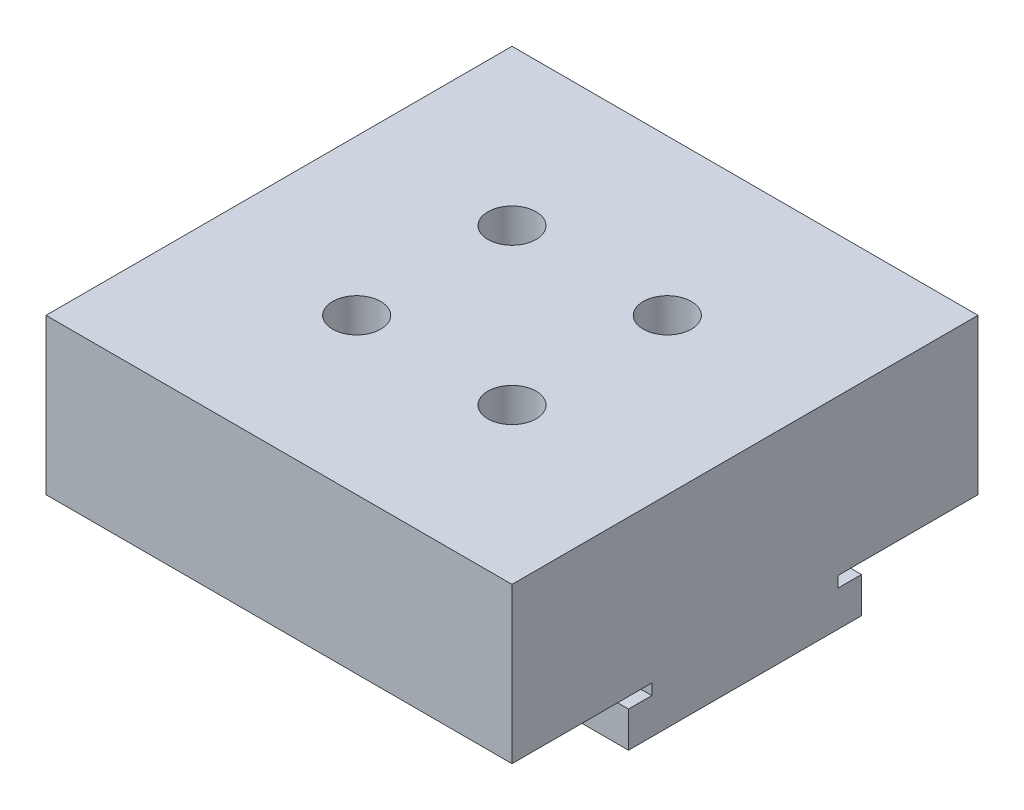
ISO-10303-21;
HEADER;
FILE_DESCRIPTION(('STEP AP214'),'2;1');
FILE_NAME('part.step','',(''),(''),'','','');
FILE_SCHEMA(('AUTOMOTIVE_DESIGN { 1 0 10303 214 1 1 1 1 }'));
ENDSEC;
DATA;
#1=APPLICATION_CONTEXT('core data for automotive mechanical design processes');
#2=APPLICATION_PROTOCOL_DEFINITION('international standard','automotive_design',2000,#1);
#3=PRODUCT_CONTEXT('',#1,'mechanical');
#4=PRODUCT('Part','Part','',(#3));
#5=PRODUCT_RELATED_PRODUCT_CATEGORY('part','',(#4));
#6=PRODUCT_DEFINITION_FORMATION('','',#4);
#7=PRODUCT_DEFINITION_CONTEXT('part definition',#1,'design');
#8=PRODUCT_DEFINITION('design','',#6,#7);
#9=PRODUCT_DEFINITION_SHAPE('','',#8);
#10=(LENGTH_UNIT() NAMED_UNIT(*) SI_UNIT(.MILLI.,.METRE.));
#11=(NAMED_UNIT(*) PLANE_ANGLE_UNIT() SI_UNIT($,.RADIAN.));
#12=(NAMED_UNIT(*) SI_UNIT($,.STERADIAN.) SOLID_ANGLE_UNIT());
#13=UNCERTAINTY_MEASURE_WITH_UNIT(LENGTH_MEASURE(1.E-05),#10,'distance_accuracy_value','');
#14=(GEOMETRIC_REPRESENTATION_CONTEXT(3) GLOBAL_UNCERTAINTY_ASSIGNED_CONTEXT((#13)) GLOBAL_UNIT_ASSIGNED_CONTEXT((#10,
#11,#12)) REPRESENTATION_CONTEXT('',''));
#15=CARTESIAN_POINT('',(0.,0.,0.));
#16=DIRECTION('',(0.,0.,1.));
#17=DIRECTION('',(1.,0.,0.));
#18=AXIS2_PLACEMENT_3D('',#15,#16,#17);
#19=CARTESIAN_POINT('',(0.,0.,0.));
#20=DIRECTION('',(0.,-1.,0.));
#21=DIRECTION('',(0.,0.,-1.));
#22=AXIS2_PLACEMENT_3D('',#19,#20,#21);
#23=PLANE('',#22);
#24=CARTESIAN_POINT('',(-5.,0.,-5.));
#25=DIRECTION('',(0.,-1.,0.));
#26=DIRECTION('',(0.,0.,-1.));
#27=AXIS2_PLACEMENT_3D('',#24,#25,#26);
#28=CIRCLE('',#27,3.5);
#29=CARTESIAN_POINT('',(-5.,0.,-8.5));
#30=VERTEX_POINT('',#29);
#31=EDGE_CURVE('E324',#30,#30,#28,.T.);
#32=ORIENTED_EDGE('',*,*,#31,.F.);
#33=EDGE_LOOP('',(#32));
#34=FACE_BOUND('',#33,.T.);
#35=CARTESIAN_POINT('',(5.,0.,-5.));
#36=DIRECTION('',(0.,-1.,0.));
#37=DIRECTION('',(0.,0.,-1.));
#38=AXIS2_PLACEMENT_3D('',#35,#36,#37);
#39=CIRCLE('',#38,3.5);
#40=CARTESIAN_POINT('',(5.,0.,-8.5));
#41=VERTEX_POINT('',#40);
#42=EDGE_CURVE('E338',#41,#41,#39,.T.);
#43=ORIENTED_EDGE('',*,*,#42,.F.);
#44=EDGE_LOOP('',(#43));
#45=FACE_BOUND('',#44,.T.);
#46=CARTESIAN_POINT('',(5.,0.,5.));
#47=DIRECTION('',(0.,-1.,0.));
#48=DIRECTION('',(0.,0.,-1.));
#49=AXIS2_PLACEMENT_3D('',#46,#47,#48);
#50=CIRCLE('',#49,3.5);
#51=CARTESIAN_POINT('',(5.,0.,1.5));
#52=VERTEX_POINT('',#51);
#53=EDGE_CURVE('E330',#52,#52,#50,.T.);
#54=ORIENTED_EDGE('',*,*,#53,.F.);
#55=EDGE_LOOP('',(#54));
#56=FACE_BOUND('',#55,.T.);
#57=CARTESIAN_POINT('',(-5.,0.,5.));
#58=DIRECTION('',(0.,-1.,0.));
#59=DIRECTION('',(0.,0.,-1.));
#60=AXIS2_PLACEMENT_3D('',#57,#58,#59);
#61=CIRCLE('',#60,3.5);
#62=CARTESIAN_POINT('',(-5.,0.,1.5));
#63=VERTEX_POINT('',#62);
#64=EDGE_CURVE('E329',#63,#63,#61,.T.);
#65=ORIENTED_EDGE('',*,*,#64,.F.);
#66=EDGE_LOOP('',(#65));
#67=FACE_BOUND('',#66,.T.);
#68=DIRECTION('',(-1.,0.,0.));
#69=VECTOR('',#68,1.);
#70=CARTESIAN_POINT('',(15.,0.,-6.));
#71=LINE('',#70,#69);
#72=CARTESIAN_POINT('',(15.,0.,-6.));
#73=VERTEX_POINT('',#72);
#74=CARTESIAN_POINT('',(9.00000000000001,0.,-6.));
#75=VERTEX_POINT('',#74);
#76=EDGE_CURVE('E189',#73,#75,#71,.T.);
#77=ORIENTED_EDGE('',*,*,#76,.T.);
#78=DIRECTION('',(0.,0.,-1.));
#79=VECTOR('',#78,1.);
#80=CARTESIAN_POINT('',(9.,0.,7.5));
#81=LINE('',#80,#79);
#82=CARTESIAN_POINT('',(9.,0.,6.));
#83=VERTEX_POINT('',#82);
#84=EDGE_CURVE('E260',#83,#75,#81,.T.);
#85=ORIENTED_EDGE('',*,*,#84,.F.);
#86=DIRECTION('',(-1.,0.,0.));
#87=VECTOR('',#86,1.);
#88=CARTESIAN_POINT('',(15.,0.,6.));
#89=LINE('',#88,#87);
#90=CARTESIAN_POINT('',(15.,0.,6.));
#91=VERTEX_POINT('',#90);
#92=EDGE_CURVE('E239',#91,#83,#89,.T.);
#93=ORIENTED_EDGE('',*,*,#92,.F.);
#94=DIRECTION('',(0.,0.,-1.));
#95=VECTOR('',#94,1.);
#96=CARTESIAN_POINT('',(15.,0.,15.));
#97=LINE('',#96,#95);
#98=CARTESIAN_POINT('',(15.,0.,15.));
#99=VERTEX_POINT('',#98);
#100=EDGE_CURVE('E390',#99,#91,#97,.T.);
#101=ORIENTED_EDGE('',*,*,#100,.F.);
#102=DIRECTION('',(1.,0.,0.));
#103=VECTOR('',#102,1.);
#104=CARTESIAN_POINT('',(-15.,0.,15.));
#105=LINE('',#104,#103);
#106=CARTESIAN_POINT('',(-15.,0.,15.));
#107=VERTEX_POINT('',#106);
#108=EDGE_CURVE('E380',#107,#99,#105,.T.);
#109=ORIENTED_EDGE('',*,*,#108,.F.);
#110=DIRECTION('',(0.,0.,1.));
#111=VECTOR('',#110,1.);
#112=CARTESIAN_POINT('',(-15.,0.,15.));
#113=LINE('',#112,#111);
#114=CARTESIAN_POINT('',(-15.,0.,6.));
#115=VERTEX_POINT('',#114);
#116=EDGE_CURVE('E396',#115,#107,#113,.T.);
#117=ORIENTED_EDGE('',*,*,#116,.F.);
#118=CARTESIAN_POINT('',(-9.,0.,6.));
#119=VERTEX_POINT('',#118);
#120=EDGE_CURVE('E223',#119,#115,#89,.T.);
#121=ORIENTED_EDGE('',*,*,#120,.F.);
#122=DIRECTION('',(0.,0.,1.));
#123=VECTOR('',#122,1.);
#124=CARTESIAN_POINT('',(-9.,0.,7.5));
#125=LINE('',#124,#123);
#126=CARTESIAN_POINT('',(-8.99999999999999,0.,-6.));
#127=VERTEX_POINT('',#126);
#128=EDGE_CURVE('E291',#127,#119,#125,.T.);
#129=ORIENTED_EDGE('',*,*,#128,.F.);
#130=CARTESIAN_POINT('',(-15.,0.,-6.));
#131=VERTEX_POINT('',#130);
#132=EDGE_CURVE('E182',#127,#131,#71,.T.);
#133=ORIENTED_EDGE('',*,*,#132,.T.);
#134=CARTESIAN_POINT('',(-15.,0.,-15.));
#135=VERTEX_POINT('',#134);
#136=EDGE_CURVE('E397',#135,#131,#113,.T.);
#137=ORIENTED_EDGE('',*,*,#136,.F.);
#138=DIRECTION('',(-1.,0.,0.));
#139=VECTOR('',#138,1.);
#140=CARTESIAN_POINT('',(-15.,0.,-15.));
#141=LINE('',#140,#139);
#142=CARTESIAN_POINT('',(15.,0.,-15.));
#143=VERTEX_POINT('',#142);
#144=EDGE_CURVE('E393',#143,#135,#141,.T.);
#145=ORIENTED_EDGE('',*,*,#144,.F.);
#146=EDGE_CURVE('E374',#73,#143,#97,.T.);
#147=ORIENTED_EDGE('',*,*,#146,.F.);
#148=EDGE_LOOP('',(#77,#85,#93,#101,#109,#117,#121,#129,#133,#137,#145,#147));
#149=FACE_BOUND('',#148,.T.);
#150=ADVANCED_FACE('F39',(#34,#45,#56,#67,#149),#23,.T.);
#151=CARTESIAN_POINT('',(-5.,10.,-5.));
#152=DIRECTION('',(0.,-1.,0.));
#153=DIRECTION('',(0.,0.,-1.));
#154=AXIS2_PLACEMENT_3D('',#151,#152,#153);
#155=CYLINDRICAL_SURFACE('',#154,1.55);
#156=CARTESIAN_POINT('',(-5.,10.,-5.));
#157=DIRECTION('',(0.,1.,0.));
#158=DIRECTION('',(0.,0.,1.));
#159=AXIS2_PLACEMENT_3D('',#156,#157,#158);
#160=CIRCLE('',#159,1.55);
#161=CARTESIAN_POINT('',(-5.,10.,-3.45));
#162=VERTEX_POINT('',#161);
#163=EDGE_CURVE('E370',#162,#162,#160,.T.);
#164=ORIENTED_EDGE('',*,*,#163,.T.);
#165=EDGE_LOOP('',(#164));
#166=FACE_BOUND('',#165,.T.);
#167=CARTESIAN_POINT('',(-5.,3.,-5.));
#168=DIRECTION('',(0.,-1.,0.));
#169=DIRECTION('',(0.,0.,-1.));
#170=AXIS2_PLACEMENT_3D('',#167,#168,#169);
#171=CIRCLE('',#170,1.55);
#172=CARTESIAN_POINT('',(-5.,3.,-6.55));
#173=VERTEX_POINT('',#172);
#174=EDGE_CURVE('E362',#173,#173,#171,.T.);
#175=ORIENTED_EDGE('',*,*,#174,.T.);
#176=EDGE_LOOP('',(#175));
#177=FACE_BOUND('',#176,.T.);
#178=ADVANCED_FACE('F471',(#166,#177),#155,.F.);
#179=CARTESIAN_POINT('',(5.,10.,-5.));
#180=DIRECTION('',(0.,-1.,0.));
#181=DIRECTION('',(0.,0.,-1.));
#182=AXIS2_PLACEMENT_3D('',#179,#180,#181);
#183=CYLINDRICAL_SURFACE('',#182,1.55);
#184=CARTESIAN_POINT('',(5.,10.,-5.));
#185=DIRECTION('',(0.,1.,0.));
#186=DIRECTION('',(0.,0.,1.));
#187=AXIS2_PLACEMENT_3D('',#184,#185,#186);
#188=CIRCLE('',#187,1.55);
#189=CARTESIAN_POINT('',(5.,10.,-3.45));
#190=VERTEX_POINT('',#189);
#191=EDGE_CURVE('E366',#190,#190,#188,.T.);
#192=ORIENTED_EDGE('',*,*,#191,.T.);
#193=EDGE_LOOP('',(#192));
#194=FACE_BOUND('',#193,.T.);
#195=CARTESIAN_POINT('',(5.,3.,-5.));
#196=DIRECTION('',(0.,-1.,0.));
#197=DIRECTION('',(0.,0.,-1.));
#198=AXIS2_PLACEMENT_3D('',#195,#196,#197);
#199=CIRCLE('',#198,1.55);
#200=CARTESIAN_POINT('',(5.,3.,-6.55));
#201=VERTEX_POINT('',#200);
#202=EDGE_CURVE('E425',#201,#201,#199,.T.);
#203=ORIENTED_EDGE('',*,*,#202,.T.);
#204=EDGE_LOOP('',(#203));
#205=FACE_BOUND('',#204,.T.);
#206=ADVANCED_FACE('F477',(#194,#205),#183,.F.);
#207=CARTESIAN_POINT('',(5.,10.,5.));
#208=DIRECTION('',(0.,-1.,0.));
#209=DIRECTION('',(0.,0.,-1.));
#210=AXIS2_PLACEMENT_3D('',#207,#208,#209);
#211=CYLINDRICAL_SURFACE('',#210,1.55);
#212=CARTESIAN_POINT('',(5.,10.,5.));
#213=DIRECTION('',(0.,1.,0.));
#214=DIRECTION('',(0.,0.,1.));
#215=AXIS2_PLACEMENT_3D('',#212,#213,#214);
#216=CIRCLE('',#215,1.55);
#217=CARTESIAN_POINT('',(5.,10.,6.55));
#218=VERTEX_POINT('',#217);
#219=EDGE_CURVE('E361',#218,#218,#216,.T.);
#220=ORIENTED_EDGE('',*,*,#219,.T.);
#221=EDGE_LOOP('',(#220));
#222=FACE_BOUND('',#221,.T.);
#223=CARTESIAN_POINT('',(5.,3.,5.));
#224=DIRECTION('',(0.,-1.,0.));
#225=DIRECTION('',(0.,0.,-1.));
#226=AXIS2_PLACEMENT_3D('',#223,#224,#225);
#227=CIRCLE('',#226,1.55);
#228=CARTESIAN_POINT('',(5.,3.,3.45));
#229=VERTEX_POINT('',#228);
#230=EDGE_CURVE('E421',#229,#229,#227,.T.);
#231=ORIENTED_EDGE('',*,*,#230,.T.);
#232=EDGE_LOOP('',(#231));
#233=FACE_BOUND('',#232,.T.);
#234=ADVANCED_FACE('F747',(#222,#233),#211,.F.);
#235=CARTESIAN_POINT('',(-5.,10.,5.));
#236=DIRECTION('',(0.,-1.,0.));
#237=DIRECTION('',(0.,0.,-1.));
#238=AXIS2_PLACEMENT_3D('',#235,#236,#237);
#239=CYLINDRICAL_SURFACE('',#238,1.55);
#240=CARTESIAN_POINT('',(-5.,10.,5.));
#241=DIRECTION('',(0.,1.,0.));
#242=DIRECTION('',(0.,0.,1.));
#243=AXIS2_PLACEMENT_3D('',#240,#241,#242);
#244=CIRCLE('',#243,1.55);
#245=CARTESIAN_POINT('',(-5.,10.,6.55));
#246=VERTEX_POINT('',#245);
#247=EDGE_CURVE('E357',#246,#246,#244,.T.);
#248=ORIENTED_EDGE('',*,*,#247,.T.);
#249=EDGE_LOOP('',(#248));
#250=FACE_BOUND('',#249,.T.);
#251=CARTESIAN_POINT('',(-5.,3.,5.));
#252=DIRECTION('',(0.,-1.,0.));
#253=DIRECTION('',(0.,0.,-1.));
#254=AXIS2_PLACEMENT_3D('',#251,#252,#253);
#255=CIRCLE('',#254,1.55);
#256=CARTESIAN_POINT('',(-5.,3.,3.45));
#257=VERTEX_POINT('',#256);
#258=EDGE_CURVE('E353',#257,#257,#255,.T.);
#259=ORIENTED_EDGE('',*,*,#258,.T.);
#260=EDGE_LOOP('',(#259));
#261=FACE_BOUND('',#260,.T.);
#262=ADVANCED_FACE('F744',(#250,#261),#239,.F.);
#263=CARTESIAN_POINT('',(0.,10.,0.));
#264=DIRECTION('',(0.,-1.,0.));
#265=DIRECTION('',(0.,0.,-1.));
#266=AXIS2_PLACEMENT_3D('',#263,#264,#265);
#267=PLANE('',#266);
#268=DIRECTION('',(0.,0.,-1.));
#269=VECTOR('',#268,1.);
#270=CARTESIAN_POINT('',(15.,10.,15.));
#271=LINE('',#270,#269);
#272=CARTESIAN_POINT('',(15.,10.,15.));
#273=VERTEX_POINT('',#272);
#274=CARTESIAN_POINT('',(15.,10.,-15.));
#275=VERTEX_POINT('',#274);
#276=EDGE_CURVE('E375',#273,#275,#271,.T.);
#277=ORIENTED_EDGE('',*,*,#276,.T.);
#278=DIRECTION('',(-1.,0.,0.));
#279=VECTOR('',#278,1.);
#280=CARTESIAN_POINT('',(-15.,10.,-15.));
#281=LINE('',#280,#279);
#282=CARTESIAN_POINT('',(-15.,10.,-15.));
#283=VERTEX_POINT('',#282);
#284=EDGE_CURVE('E379',#275,#283,#281,.T.);
#285=ORIENTED_EDGE('',*,*,#284,.T.);
#286=DIRECTION('',(0.,0.,1.));
#287=VECTOR('',#286,1.);
#288=CARTESIAN_POINT('',(-15.,10.,15.));
#289=LINE('',#288,#287);
#290=CARTESIAN_POINT('',(-15.,10.,15.));
#291=VERTEX_POINT('',#290);
#292=EDGE_CURVE('E383',#283,#291,#289,.T.);
#293=ORIENTED_EDGE('',*,*,#292,.T.);
#294=DIRECTION('',(1.,0.,0.));
#295=VECTOR('',#294,1.);
#296=CARTESIAN_POINT('',(-15.,10.,15.));
#297=LINE('',#296,#295);
#298=EDGE_CURVE('E386',#291,#273,#297,.T.);
#299=ORIENTED_EDGE('',*,*,#298,.T.);
#300=EDGE_LOOP('',(#277,#285,#293,#299));
#301=FACE_BOUND('',#300,.T.);
#302=ORIENTED_EDGE('',*,*,#163,.F.);
#303=EDGE_LOOP('',(#302));
#304=FACE_BOUND('',#303,.T.);
#305=ORIENTED_EDGE('',*,*,#191,.F.);
#306=EDGE_LOOP('',(#305));
#307=FACE_BOUND('',#306,.T.);
#308=ORIENTED_EDGE('',*,*,#219,.F.);
#309=EDGE_LOOP('',(#308));
#310=FACE_BOUND('',#309,.T.);
#311=ORIENTED_EDGE('',*,*,#247,.F.);
#312=EDGE_LOOP('',(#311));
#313=FACE_BOUND('',#312,.T.);
#314=ADVANCED_FACE('F484',(#301,#304,#307,#310,#313),#267,.F.);
#315=CARTESIAN_POINT('',(15.,10.,15.));
#316=DIRECTION('',(-1.,0.,0.));
#317=DIRECTION('',(0.,0.,1.));
#318=AXIS2_PLACEMENT_3D('',#315,#316,#317);
#319=PLANE('',#318);
#320=DIRECTION('',(0.,1.,0.));
#321=VECTOR('',#320,1.);
#322=CARTESIAN_POINT('',(15.,0.,-6.));
#323=LINE('',#322,#321);
#324=CARTESIAN_POINT('',(15.,-0.7,-6.));
#325=VERTEX_POINT('',#324);
#326=EDGE_CURVE('E186',#325,#73,#323,.T.);
#327=ORIENTED_EDGE('',*,*,#326,.T.);
#328=ORIENTED_EDGE('',*,*,#146,.T.);
#329=DIRECTION('',(0.,-1.,0.));
#330=VECTOR('',#329,1.);
#331=CARTESIAN_POINT('',(15.,10.,-15.));
#332=LINE('',#331,#330);
#333=EDGE_CURVE('E413',#275,#143,#332,.T.);
#334=ORIENTED_EDGE('',*,*,#333,.F.);
#335=ORIENTED_EDGE('',*,*,#276,.F.);
#336=DIRECTION('',(0.,-1.,0.));
#337=VECTOR('',#336,1.);
#338=CARTESIAN_POINT('',(15.,10.,15.));
#339=LINE('',#338,#337);
#340=EDGE_CURVE('E389',#273,#99,#339,.T.);
#341=ORIENTED_EDGE('',*,*,#340,.T.);
#342=ORIENTED_EDGE('',*,*,#100,.T.);
#343=DIRECTION('',(0.,-1.,0.));
#344=VECTOR('',#343,1.);
#345=CARTESIAN_POINT('',(15.,0.,6.));
#346=LINE('',#345,#344);
#347=CARTESIAN_POINT('',(15.,-0.7,6.));
#348=VERTEX_POINT('',#347);
#349=EDGE_CURVE('E214',#91,#348,#346,.T.);
#350=ORIENTED_EDGE('',*,*,#349,.T.);
#351=DIRECTION('',(0.,0.,1.));
#352=VECTOR('',#351,1.);
#353=CARTESIAN_POINT('',(15.,-0.7,7.5));
#354=LINE('',#353,#352);
#355=CARTESIAN_POINT('',(15.,-0.7,7.5));
#356=VERTEX_POINT('',#355);
#357=EDGE_CURVE('E218',#348,#356,#354,.T.);
#358=ORIENTED_EDGE('',*,*,#357,.T.);
#359=DIRECTION('',(0.,1.,0.));
#360=VECTOR('',#359,1.);
#361=CARTESIAN_POINT('',(15.,-3.,7.5));
#362=LINE('',#361,#360);
#363=CARTESIAN_POINT('',(15.,-3.,7.5));
#364=VERTEX_POINT('',#363);
#365=EDGE_CURVE('E287',#364,#356,#362,.T.);
#366=ORIENTED_EDGE('',*,*,#365,.F.);
#367=DIRECTION('',(0.,0.,1.));
#368=VECTOR('',#367,1.);
#369=CARTESIAN_POINT('',(15.,-3.,7.5));
#370=LINE('',#369,#368);
#371=CARTESIAN_POINT('',(15.,-3.,-7.5));
#372=VERTEX_POINT('',#371);
#373=EDGE_CURVE('E261',#372,#364,#370,.T.);
#374=ORIENTED_EDGE('',*,*,#373,.F.);
#375=DIRECTION('',(0.,1.,0.));
#376=VECTOR('',#375,1.);
#377=CARTESIAN_POINT('',(15.,-3.,-7.5));
#378=LINE('',#377,#376);
#379=CARTESIAN_POINT('',(15.,-0.7,-7.5));
#380=VERTEX_POINT('',#379);
#381=EDGE_CURVE('E197',#372,#380,#378,.T.);
#382=ORIENTED_EDGE('',*,*,#381,.T.);
#383=DIRECTION('',(0.,0.,1.));
#384=VECTOR('',#383,1.);
#385=CARTESIAN_POINT('',(15.,-0.7,-7.5));
#386=LINE('',#385,#384);
#387=EDGE_CURVE('E63',#380,#325,#386,.T.);
#388=ORIENTED_EDGE('',*,*,#387,.T.);
#389=EDGE_LOOP('',(#327,#328,#334,#335,#341,#342,#350,#358,#366,#374,#382,#388));
#390=FACE_BOUND('',#389,.T.);
#391=ADVANCED_FACE('F41',(#390),#319,.F.);
#392=CARTESIAN_POINT('',(-15.,10.,-15.));
#393=DIRECTION('',(0.,0.,1.));
#394=DIRECTION('',(1.,0.,0.));
#395=AXIS2_PLACEMENT_3D('',#392,#393,#394);
#396=PLANE('',#395);
#397=ORIENTED_EDGE('',*,*,#144,.T.);
#398=DIRECTION('',(0.,-1.,0.));
#399=VECTOR('',#398,1.);
#400=CARTESIAN_POINT('',(-15.,10.,-15.));
#401=LINE('',#400,#399);
#402=EDGE_CURVE('E409',#283,#135,#401,.T.);
#403=ORIENTED_EDGE('',*,*,#402,.F.);
#404=ORIENTED_EDGE('',*,*,#284,.F.);
#405=ORIENTED_EDGE('',*,*,#333,.T.);
#406=EDGE_LOOP('',(#397,#403,#404,#405));
#407=FACE_BOUND('',#406,.T.);
#408=ADVANCED_FACE('F492',(#407),#396,.F.);
#409=CARTESIAN_POINT('',(-15.,10.,15.));
#410=DIRECTION('',(1.,0.,0.));
#411=DIRECTION('',(0.,0.,-1.));
#412=AXIS2_PLACEMENT_3D('',#409,#410,#411);
#413=PLANE('',#412);
#414=ORIENTED_EDGE('',*,*,#136,.T.);
#415=DIRECTION('',(0.,1.,0.));
#416=VECTOR('',#415,1.);
#417=CARTESIAN_POINT('',(-15.,0.,-6.));
#418=LINE('',#417,#416);
#419=CARTESIAN_POINT('',(-15.,-0.7,-6.));
#420=VERTEX_POINT('',#419);
#421=EDGE_CURVE('E199',#420,#131,#418,.T.);
#422=ORIENTED_EDGE('',*,*,#421,.F.);
#423=DIRECTION('',(0.,0.,1.));
#424=VECTOR('',#423,1.);
#425=CARTESIAN_POINT('',(-15.,-0.7,-7.5));
#426=LINE('',#425,#424);
#427=CARTESIAN_POINT('',(-15.,-0.7,-7.5));
#428=VERTEX_POINT('',#427);
#429=EDGE_CURVE('E203',#428,#420,#426,.T.);
#430=ORIENTED_EDGE('',*,*,#429,.F.);
#431=DIRECTION('',(0.,1.,0.));
#432=VECTOR('',#431,1.);
#433=CARTESIAN_POINT('',(-15.,-3.,-7.5));
#434=LINE('',#433,#432);
#435=CARTESIAN_POINT('',(-15.,-3.,-7.5));
#436=VERTEX_POINT('',#435);
#437=EDGE_CURVE('E320',#436,#428,#434,.T.);
#438=ORIENTED_EDGE('',*,*,#437,.F.);
#439=DIRECTION('',(0.,0.,-1.));
#440=VECTOR('',#439,1.);
#441=CARTESIAN_POINT('',(-15.,-3.,7.5));
#442=LINE('',#441,#440);
#443=CARTESIAN_POINT('',(-15.,-3.,7.5));
#444=VERTEX_POINT('',#443);
#445=EDGE_CURVE('E292',#444,#436,#442,.T.);
#446=ORIENTED_EDGE('',*,*,#445,.F.);
#447=DIRECTION('',(0.,1.,0.));
#448=VECTOR('',#447,1.);
#449=CARTESIAN_POINT('',(-15.,-3.,7.5));
#450=LINE('',#449,#448);
#451=CARTESIAN_POINT('',(-15.,-0.7,7.5));
#452=VERTEX_POINT('',#451);
#453=EDGE_CURVE('E305',#444,#452,#450,.T.);
#454=ORIENTED_EDGE('',*,*,#453,.T.);
#455=DIRECTION('',(0.,0.,1.));
#456=VECTOR('',#455,1.);
#457=CARTESIAN_POINT('',(-15.,-0.7,7.5));
#458=LINE('',#457,#456);
#459=CARTESIAN_POINT('',(-15.,-0.7,6.));
#460=VERTEX_POINT('',#459);
#461=EDGE_CURVE('E219',#460,#452,#458,.T.);
#462=ORIENTED_EDGE('',*,*,#461,.F.);
#463=DIRECTION('',(0.,-1.,0.));
#464=VECTOR('',#463,1.);
#465=CARTESIAN_POINT('',(-15.,0.,6.));
#466=LINE('',#465,#464);
#467=EDGE_CURVE('E224',#115,#460,#466,.T.);
#468=ORIENTED_EDGE('',*,*,#467,.F.);
#469=ORIENTED_EDGE('',*,*,#116,.T.);
#470=DIRECTION('',(0.,-1.,0.));
#471=VECTOR('',#470,1.);
#472=CARTESIAN_POINT('',(-15.,10.,15.));
#473=LINE('',#472,#471);
#474=EDGE_CURVE('E405',#291,#107,#473,.T.);
#475=ORIENTED_EDGE('',*,*,#474,.F.);
#476=ORIENTED_EDGE('',*,*,#292,.F.);
#477=ORIENTED_EDGE('',*,*,#402,.T.);
#478=EDGE_LOOP('',(#414,#422,#430,#438,#446,#454,#462,#468,#469,#475,#476,#477));
#479=FACE_BOUND('',#478,.T.);
#480=ADVANCED_FACE('F489',(#479),#413,.F.);
#481=CARTESIAN_POINT('',(-15.,10.,15.));
#482=DIRECTION('',(0.,0.,-1.));
#483=DIRECTION('',(-1.,0.,0.));
#484=AXIS2_PLACEMENT_3D('',#481,#482,#483);
#485=PLANE('',#484);
#486=ORIENTED_EDGE('',*,*,#108,.T.);
#487=ORIENTED_EDGE('',*,*,#340,.F.);
#488=ORIENTED_EDGE('',*,*,#298,.F.);
#489=ORIENTED_EDGE('',*,*,#474,.T.);
#490=EDGE_LOOP('',(#486,#487,#488,#489));
#491=FACE_BOUND('',#490,.T.);
#492=ADVANCED_FACE('F485',(#491),#485,.F.);
#493=CARTESIAN_POINT('',(-5.,3.,5.));
#494=DIRECTION('',(0.,-1.,0.));
#495=DIRECTION('',(0.,0.,-1.));
#496=AXIS2_PLACEMENT_3D('',#493,#494,#495);
#497=CYLINDRICAL_SURFACE('',#496,3.5);
#498=CARTESIAN_POINT('',(-5.,3.,5.));
#499=DIRECTION('',(0.,-1.,0.));
#500=DIRECTION('',(0.,0.,-1.));
#501=AXIS2_PLACEMENT_3D('',#498,#499,#500);
#502=CIRCLE('',#501,3.5);
#503=CARTESIAN_POINT('',(-5.,3.,1.5));
#504=VERTEX_POINT('',#503);
#505=EDGE_CURVE('E349',#504,#504,#502,.T.);
#506=ORIENTED_EDGE('',*,*,#505,.F.);
#507=EDGE_LOOP('',(#506));
#508=FACE_BOUND('',#507,.T.);
#509=ORIENTED_EDGE('',*,*,#64,.T.);
#510=EDGE_LOOP('',(#509));
#511=FACE_BOUND('',#510,.T.);
#512=ADVANCED_FACE('F488',(#508,#511),#497,.F.);
#513=CARTESIAN_POINT('',(-5.,3.,5.));
#514=DIRECTION('',(0.,-1.,0.));
#515=DIRECTION('',(0.,0.,-1.));
#516=AXIS2_PLACEMENT_3D('',#513,#514,#515);
#517=PLANE('',#516);
#518=ORIENTED_EDGE('',*,*,#258,.F.);
#519=EDGE_LOOP('',(#518));
#520=FACE_BOUND('',#519,.T.);
#521=ORIENTED_EDGE('',*,*,#505,.T.);
#522=EDGE_LOOP('',(#521));
#523=FACE_BOUND('',#522,.T.);
#524=ADVANCED_FACE('F639',(#520,#523),#517,.T.);
#525=CARTESIAN_POINT('',(5.,3.,5.));
#526=DIRECTION('',(0.,-1.,0.));
#527=DIRECTION('',(0.,0.,-1.));
#528=AXIS2_PLACEMENT_3D('',#525,#526,#527);
#529=CYLINDRICAL_SURFACE('',#528,3.5);
#530=CARTESIAN_POINT('',(5.,3.,5.));
#531=DIRECTION('',(0.,-1.,0.));
#532=DIRECTION('',(0.,0.,-1.));
#533=AXIS2_PLACEMENT_3D('',#530,#531,#532);
#534=CIRCLE('',#533,3.5);
#535=CARTESIAN_POINT('',(5.,3.,1.5));
#536=VERTEX_POINT('',#535);
#537=EDGE_CURVE('E325',#536,#536,#534,.T.);
#538=ORIENTED_EDGE('',*,*,#537,.F.);
#539=EDGE_LOOP('',(#538));
#540=FACE_BOUND('',#539,.T.);
#541=ORIENTED_EDGE('',*,*,#53,.T.);
#542=EDGE_LOOP('',(#541));
#543=FACE_BOUND('',#542,.T.);
#544=ADVANCED_FACE('F648',(#540,#543),#529,.F.);
#545=CARTESIAN_POINT('',(5.,3.,5.));
#546=DIRECTION('',(0.,-1.,0.));
#547=DIRECTION('',(0.,0.,-1.));
#548=AXIS2_PLACEMENT_3D('',#545,#546,#547);
#549=PLANE('',#548);
#550=ORIENTED_EDGE('',*,*,#230,.F.);
#551=EDGE_LOOP('',(#550));
#552=FACE_BOUND('',#551,.T.);
#553=ORIENTED_EDGE('',*,*,#537,.T.);
#554=EDGE_LOOP('',(#553));
#555=FACE_BOUND('',#554,.T.);
#556=ADVANCED_FACE('F653',(#552,#555),#549,.T.);
#557=CARTESIAN_POINT('',(5.,3.,-5.));
#558=DIRECTION('',(0.,-1.,0.));
#559=DIRECTION('',(0.,0.,-1.));
#560=AXIS2_PLACEMENT_3D('',#557,#558,#559);
#561=CYLINDRICAL_SURFACE('',#560,3.5);
#562=CARTESIAN_POINT('',(5.,3.,-5.));
#563=DIRECTION('',(0.,-1.,0.));
#564=DIRECTION('',(0.,0.,-1.));
#565=AXIS2_PLACEMENT_3D('',#562,#563,#564);
#566=CIRCLE('',#565,3.5);
#567=CARTESIAN_POINT('',(5.,3.,-8.5));
#568=VERTEX_POINT('',#567);
#569=EDGE_CURVE('E334',#568,#568,#566,.T.);
#570=ORIENTED_EDGE('',*,*,#569,.F.);
#571=EDGE_LOOP('',(#570));
#572=FACE_BOUND('',#571,.T.);
#573=ORIENTED_EDGE('',*,*,#42,.T.);
#574=EDGE_LOOP('',(#573));
#575=FACE_BOUND('',#574,.T.);
#576=ADVANCED_FACE('F661',(#572,#575),#561,.F.);
#577=CARTESIAN_POINT('',(5.,3.,-5.));
#578=DIRECTION('',(0.,-1.,0.));
#579=DIRECTION('',(0.,0.,-1.));
#580=AXIS2_PLACEMENT_3D('',#577,#578,#579);
#581=PLANE('',#580);
#582=ORIENTED_EDGE('',*,*,#202,.F.);
#583=EDGE_LOOP('',(#582));
#584=FACE_BOUND('',#583,.T.);
#585=ORIENTED_EDGE('',*,*,#569,.T.);
#586=EDGE_LOOP('',(#585));
#587=FACE_BOUND('',#586,.T.);
#588=ADVANCED_FACE('F666',(#584,#587),#581,.T.);
#589=CARTESIAN_POINT('',(-5.,3.,-5.));
#590=DIRECTION('',(0.,-1.,0.));
#591=DIRECTION('',(0.,0.,-1.));
#592=AXIS2_PLACEMENT_3D('',#589,#590,#591);
#593=CYLINDRICAL_SURFACE('',#592,3.5);
#594=CARTESIAN_POINT('',(-5.,3.,-5.));
#595=DIRECTION('',(0.,-1.,0.));
#596=DIRECTION('',(0.,0.,-1.));
#597=AXIS2_PLACEMENT_3D('',#594,#595,#596);
#598=CIRCLE('',#597,3.5);
#599=CARTESIAN_POINT('',(-5.,3.,-8.5));
#600=VERTEX_POINT('',#599);
#601=EDGE_CURVE('E342',#600,#600,#598,.T.);
#602=ORIENTED_EDGE('',*,*,#601,.F.);
#603=EDGE_LOOP('',(#602));
#604=FACE_BOUND('',#603,.T.);
#605=ORIENTED_EDGE('',*,*,#31,.T.);
#606=EDGE_LOOP('',(#605));
#607=FACE_BOUND('',#606,.T.);
#608=ADVANCED_FACE('F674',(#604,#607),#593,.F.);
#609=CARTESIAN_POINT('',(-5.,3.,-5.));
#610=DIRECTION('',(0.,-1.,0.));
#611=DIRECTION('',(0.,0.,-1.));
#612=AXIS2_PLACEMENT_3D('',#609,#610,#611);
#613=PLANE('',#612);
#614=ORIENTED_EDGE('',*,*,#174,.F.);
#615=EDGE_LOOP('',(#614));
#616=FACE_BOUND('',#615,.T.);
#617=ORIENTED_EDGE('',*,*,#601,.T.);
#618=EDGE_LOOP('',(#617));
#619=FACE_BOUND('',#618,.T.);
#620=ADVANCED_FACE('F679',(#616,#619),#613,.T.);
#621=CARTESIAN_POINT('',(-15.,-3.,-7.5));
#622=DIRECTION('',(0.,0.,1.));
#623=DIRECTION('',(1.,0.,0.));
#624=AXIS2_PLACEMENT_3D('',#621,#622,#623);
#625=PLANE('',#624);
#626=ORIENTED_EDGE('',*,*,#437,.T.);
#627=DIRECTION('',(-1.,0.,0.));
#628=VECTOR('',#627,1.);
#629=CARTESIAN_POINT('',(15.,-0.7,-7.5));
#630=LINE('',#629,#628);
#631=CARTESIAN_POINT('',(-8.99999999999999,-0.7,-7.5));
#632=VERTEX_POINT('',#631);
#633=EDGE_CURVE('E192',#632,#428,#630,.T.);
#634=ORIENTED_EDGE('',*,*,#633,.F.);
#635=DIRECTION('',(0.,1.,0.));
#636=VECTOR('',#635,1.);
#637=CARTESIAN_POINT('',(-8.99999999999999,-3.,-7.5));
#638=LINE('',#637,#636);
#639=CARTESIAN_POINT('',(-8.99999999999999,-3.,-7.5));
#640=VERTEX_POINT('',#639);
#641=EDGE_CURVE('E316',#640,#632,#638,.T.);
#642=ORIENTED_EDGE('',*,*,#641,.F.);
#643=DIRECTION('',(1.,0.,0.));
#644=VECTOR('',#643,1.);
#645=CARTESIAN_POINT('',(-15.,-3.,-7.5));
#646=LINE('',#645,#644);
#647=EDGE_CURVE('E296',#436,#640,#646,.T.);
#648=ORIENTED_EDGE('',*,*,#647,.F.);
#649=EDGE_LOOP('',(#626,#634,#642,#648));
#650=FACE_BOUND('',#649,.T.);
#651=ADVANCED_FACE('F517',(#650),#625,.F.);
#652=CARTESIAN_POINT('',(-9.,-3.,7.5));
#653=DIRECTION('',(-1.,0.,0.));
#654=DIRECTION('',(0.,0.,1.));
#655=AXIS2_PLACEMENT_3D('',#652,#653,#654);
#656=PLANE('',#655);
#657=DIRECTION('',(0.,0.,1.));
#658=VECTOR('',#657,1.);
#659=CARTESIAN_POINT('',(-9.,-0.7,7.5));
#660=LINE('',#659,#658);
#661=CARTESIAN_POINT('',(-8.99999999999999,-0.7,-6.));
#662=VERTEX_POINT('',#661);
#663=EDGE_CURVE('E244',#632,#662,#660,.T.);
#664=ORIENTED_EDGE('',*,*,#663,.T.);
#665=DIRECTION('',(0.,1.,0.));
#666=VECTOR('',#665,1.);
#667=CARTESIAN_POINT('',(-8.99999999999999,-3.,-6.));
#668=LINE('',#667,#666);
#669=EDGE_CURVE('E256',#662,#127,#668,.T.);
#670=ORIENTED_EDGE('',*,*,#669,.T.);
#671=ORIENTED_EDGE('',*,*,#128,.T.);
#672=DIRECTION('',(0.,-1.,0.));
#673=VECTOR('',#672,1.);
#674=CARTESIAN_POINT('',(-9.,-3.,6.));
#675=LINE('',#674,#673);
#676=CARTESIAN_POINT('',(-9.,-0.7,6.));
#677=VERTEX_POINT('',#676);
#678=EDGE_CURVE('E248',#119,#677,#675,.T.);
#679=ORIENTED_EDGE('',*,*,#678,.T.);
#680=DIRECTION('',(0.,0.,1.));
#681=VECTOR('',#680,1.);
#682=CARTESIAN_POINT('',(-9.,-0.7,7.5));
#683=LINE('',#682,#681);
#684=CARTESIAN_POINT('',(-9.,-0.7,7.5));
#685=VERTEX_POINT('',#684);
#686=EDGE_CURVE('E252',#677,#685,#683,.T.);
#687=ORIENTED_EDGE('',*,*,#686,.T.);
#688=DIRECTION('',(0.,1.,0.));
#689=VECTOR('',#688,1.);
#690=CARTESIAN_POINT('',(-9.,-3.,7.5));
#691=LINE('',#690,#689);
#692=CARTESIAN_POINT('',(-9.,-3.,7.5));
#693=VERTEX_POINT('',#692);
#694=EDGE_CURVE('E312',#693,#685,#691,.T.);
#695=ORIENTED_EDGE('',*,*,#694,.F.);
#696=DIRECTION('',(0.,0.,1.));
#697=VECTOR('',#696,1.);
#698=CARTESIAN_POINT('',(-9.,-3.,7.5));
#699=LINE('',#698,#697);
#700=EDGE_CURVE('E299',#640,#693,#699,.T.);
#701=ORIENTED_EDGE('',*,*,#700,.F.);
#702=ORIENTED_EDGE('',*,*,#641,.T.);
#703=EDGE_LOOP('',(#664,#670,#671,#679,#687,#695,#701,#702));
#704=FACE_BOUND('',#703,.T.);
#705=ADVANCED_FACE('F548',(#704),#656,.F.);
#706=CARTESIAN_POINT('',(-15.,-3.,7.5));
#707=DIRECTION('',(0.,0.,-1.));
#708=DIRECTION('',(-1.,0.,0.));
#709=AXIS2_PLACEMENT_3D('',#706,#707,#708);
#710=PLANE('',#709);
#711=ORIENTED_EDGE('',*,*,#694,.T.);
#712=DIRECTION('',(-1.,0.,0.));
#713=VECTOR('',#712,1.);
#714=CARTESIAN_POINT('',(15.,-0.7,7.5));
#715=LINE('',#714,#713);
#716=EDGE_CURVE('E233',#685,#452,#715,.T.);
#717=ORIENTED_EDGE('',*,*,#716,.T.);
#718=ORIENTED_EDGE('',*,*,#453,.F.);
#719=DIRECTION('',(-1.,0.,0.));
#720=VECTOR('',#719,1.);
#721=CARTESIAN_POINT('',(-15.,-3.,7.5));
#722=LINE('',#721,#720);
#723=EDGE_CURVE('E302',#693,#444,#722,.T.);
#724=ORIENTED_EDGE('',*,*,#723,.F.);
#725=EDGE_LOOP('',(#711,#717,#718,#724));
#726=FACE_BOUND('',#725,.T.);
#727=ADVANCED_FACE('F528',(#726),#710,.F.);
#728=CARTESIAN_POINT('',(0.,-3.,0.));
#729=DIRECTION('',(0.,-1.,0.));
#730=DIRECTION('',(0.,0.,-1.));
#731=AXIS2_PLACEMENT_3D('',#728,#729,#730);
#732=PLANE('',#731);
#733=ORIENTED_EDGE('',*,*,#445,.T.);
#734=ORIENTED_EDGE('',*,*,#647,.T.);
#735=ORIENTED_EDGE('',*,*,#700,.T.);
#736=ORIENTED_EDGE('',*,*,#723,.T.);
#737=EDGE_LOOP('',(#733,#734,#735,#736));
#738=FACE_BOUND('',#737,.T.);
#739=ADVANCED_FACE('F521',(#738),#732,.T.);
#740=CARTESIAN_POINT('',(15.,-3.,7.5));
#741=DIRECTION('',(0.,0.,-1.));
#742=DIRECTION('',(-1.,0.,0.));
#743=AXIS2_PLACEMENT_3D('',#740,#741,#742);
#744=PLANE('',#743);
#745=ORIENTED_EDGE('',*,*,#365,.T.);
#746=CARTESIAN_POINT('',(9.,-0.7,7.5));
#747=VERTEX_POINT('',#746);
#748=EDGE_CURVE('E207',#356,#747,#715,.T.);
#749=ORIENTED_EDGE('',*,*,#748,.T.);
#750=DIRECTION('',(0.,1.,0.));
#751=VECTOR('',#750,1.);
#752=CARTESIAN_POINT('',(9.,-3.,7.5));
#753=LINE('',#752,#751);
#754=CARTESIAN_POINT('',(9.,-3.,7.5));
#755=VERTEX_POINT('',#754);
#756=EDGE_CURVE('E283',#755,#747,#753,.T.);
#757=ORIENTED_EDGE('',*,*,#756,.F.);
#758=DIRECTION('',(-1.,0.,0.));
#759=VECTOR('',#758,1.);
#760=CARTESIAN_POINT('',(15.,-3.,7.5));
#761=LINE('',#760,#759);
#762=EDGE_CURVE('E265',#364,#755,#761,.T.);
#763=ORIENTED_EDGE('',*,*,#762,.F.);
#764=EDGE_LOOP('',(#745,#749,#757,#763));
#765=FACE_BOUND('',#764,.T.);
#766=ADVANCED_FACE('F445',(#765),#744,.F.);
#767=CARTESIAN_POINT('',(9.,-3.,7.5));
#768=DIRECTION('',(1.,0.,0.));
#769=DIRECTION('',(0.,0.,-1.));
#770=AXIS2_PLACEMENT_3D('',#767,#768,#769);
#771=PLANE('',#770);
#772=ORIENTED_EDGE('',*,*,#84,.T.);
#773=DIRECTION('',(0.,-1.,0.));
#774=VECTOR('',#773,1.);
#775=CARTESIAN_POINT('',(9.00000000000001,-3.,-6.));
#776=LINE('',#775,#774);
#777=CARTESIAN_POINT('',(9.00000000000001,-0.7,-6.));
#778=VERTEX_POINT('',#777);
#779=EDGE_CURVE('E11',#75,#778,#776,.T.);
#780=ORIENTED_EDGE('',*,*,#779,.T.);
#781=DIRECTION('',(0.,0.,-1.));
#782=VECTOR('',#781,1.);
#783=CARTESIAN_POINT('',(9.,-0.7,7.5));
#784=LINE('',#783,#782);
#785=CARTESIAN_POINT('',(9.00000000000001,-0.7,-7.5));
#786=VERTEX_POINT('',#785);
#787=EDGE_CURVE('E179',#778,#786,#784,.T.);
#788=ORIENTED_EDGE('',*,*,#787,.T.);
#789=DIRECTION('',(0.,1.,0.));
#790=VECTOR('',#789,1.);
#791=CARTESIAN_POINT('',(9.00000000000001,-3.,-7.5));
#792=LINE('',#791,#790);
#793=CARTESIAN_POINT('',(9.00000000000001,-3.,-7.5));
#794=VERTEX_POINT('',#793);
#795=EDGE_CURVE('E279',#794,#786,#792,.T.);
#796=ORIENTED_EDGE('',*,*,#795,.F.);
#797=DIRECTION('',(0.,0.,-1.));
#798=VECTOR('',#797,1.);
#799=CARTESIAN_POINT('',(9.,-3.,7.5));
#800=LINE('',#799,#798);
#801=EDGE_CURVE('E268',#755,#794,#800,.T.);
#802=ORIENTED_EDGE('',*,*,#801,.F.);
#803=ORIENTED_EDGE('',*,*,#756,.T.);
#804=DIRECTION('',(0.,0.,-1.));
#805=VECTOR('',#804,1.);
#806=CARTESIAN_POINT('',(9.,-0.7,7.5));
#807=LINE('',#806,#805);
#808=CARTESIAN_POINT('',(9.,-0.7,6.));
#809=VERTEX_POINT('',#808);
#810=EDGE_CURVE('E48',#747,#809,#807,.T.);
#811=ORIENTED_EDGE('',*,*,#810,.T.);
#812=DIRECTION('',(0.,1.,0.));
#813=VECTOR('',#812,1.);
#814=CARTESIAN_POINT('',(9.,-3.,6.));
#815=LINE('',#814,#813);
#816=EDGE_CURVE('E417',#809,#83,#815,.T.);
#817=ORIENTED_EDGE('',*,*,#816,.T.);
#818=EDGE_LOOP('',(#772,#780,#788,#796,#802,#803,#811,#817));
#819=FACE_BOUND('',#818,.T.);
#820=ADVANCED_FACE('F437',(#819),#771,.F.);
#821=CARTESIAN_POINT('',(15.,-3.,-7.5));
#822=DIRECTION('',(0.,0.,1.));
#823=DIRECTION('',(1.,0.,0.));
#824=AXIS2_PLACEMENT_3D('',#821,#822,#823);
#825=PLANE('',#824);
#826=ORIENTED_EDGE('',*,*,#795,.T.);
#827=EDGE_CURVE('E211',#380,#786,#630,.T.);
#828=ORIENTED_EDGE('',*,*,#827,.F.);
#829=ORIENTED_EDGE('',*,*,#381,.F.);
#830=DIRECTION('',(1.,0.,0.));
#831=VECTOR('',#830,1.);
#832=CARTESIAN_POINT('',(15.,-3.,-7.5));
#833=LINE('',#832,#831);
#834=EDGE_CURVE('E271',#794,#372,#833,.T.);
#835=ORIENTED_EDGE('',*,*,#834,.F.);
#836=EDGE_LOOP('',(#826,#828,#829,#835));
#837=FACE_BOUND('',#836,.T.);
#838=ADVANCED_FACE('F457',(#837),#825,.F.);
#839=CARTESIAN_POINT('',(0.,-3.,0.));
#840=DIRECTION('',(0.,1.,0.));
#841=DIRECTION('',(0.,0.,1.));
#842=AXIS2_PLACEMENT_3D('',#839,#840,#841);
#843=PLANE('',#842);
#844=ORIENTED_EDGE('',*,*,#373,.T.);
#845=ORIENTED_EDGE('',*,*,#762,.T.);
#846=ORIENTED_EDGE('',*,*,#801,.T.);
#847=ORIENTED_EDGE('',*,*,#834,.T.);
#848=EDGE_LOOP('',(#844,#845,#846,#847));
#849=FACE_BOUND('',#848,.T.);
#850=ADVANCED_FACE('F459',(#849),#843,.F.);
#851=CARTESIAN_POINT('',(15.,-0.7,-7.5));
#852=DIRECTION('',(0.,-1.,0.));
#853=DIRECTION('',(0.,0.,-1.));
#854=AXIS2_PLACEMENT_3D('',#851,#852,#853);
#855=PLANE('',#854);
#856=DIRECTION('',(-1.,0.,0.));
#857=VECTOR('',#856,1.);
#858=CARTESIAN_POINT('',(15.,-0.7,-6.));
#859=LINE('',#858,#857);
#860=EDGE_CURVE('E175',#325,#778,#859,.T.);
#861=ORIENTED_EDGE('',*,*,#860,.F.);
#862=ORIENTED_EDGE('',*,*,#387,.F.);
#863=ORIENTED_EDGE('',*,*,#827,.T.);
#864=ORIENTED_EDGE('',*,*,#787,.F.);
#865=EDGE_LOOP('',(#861,#862,#863,#864));
#866=FACE_BOUND('',#865,.T.);
#867=ADVANCED_FACE('F177',(#866),#855,.F.);
#868=CARTESIAN_POINT('',(15.,0.,-6.));
#869=DIRECTION('',(0.,0.,1.));
#870=DIRECTION('',(1.,0.,0.));
#871=AXIS2_PLACEMENT_3D('',#868,#869,#870);
#872=PLANE('',#871);
#873=ORIENTED_EDGE('',*,*,#76,.F.);
#874=ORIENTED_EDGE('',*,*,#326,.F.);
#875=ORIENTED_EDGE('',*,*,#860,.T.);
#876=ORIENTED_EDGE('',*,*,#779,.F.);
#877=EDGE_LOOP('',(#873,#874,#875,#876));
#878=FACE_BOUND('',#877,.T.);
#879=ADVANCED_FACE('F187',(#878),#872,.F.);
#880=CARTESIAN_POINT('',(15.,0.,6.));
#881=DIRECTION('',(0.,0.,-1.));
#882=DIRECTION('',(-1.,0.,0.));
#883=AXIS2_PLACEMENT_3D('',#880,#881,#882);
#884=PLANE('',#883);
#885=DIRECTION('',(-1.,0.,0.));
#886=VECTOR('',#885,1.);
#887=CARTESIAN_POINT('',(15.,-0.7,6.));
#888=LINE('',#887,#886);
#889=EDGE_CURVE('E234',#348,#809,#888,.T.);
#890=ORIENTED_EDGE('',*,*,#889,.F.);
#891=ORIENTED_EDGE('',*,*,#349,.F.);
#892=ORIENTED_EDGE('',*,*,#92,.T.);
#893=ORIENTED_EDGE('',*,*,#816,.F.);
#894=EDGE_LOOP('',(#890,#891,#892,#893));
#895=FACE_BOUND('',#894,.T.);
#896=ADVANCED_FACE('F451',(#895),#884,.F.);
#897=CARTESIAN_POINT('',(15.,-0.7,7.5));
#898=DIRECTION('',(0.,-1.,0.));
#899=DIRECTION('',(0.,0.,-1.));
#900=AXIS2_PLACEMENT_3D('',#897,#898,#899);
#901=PLANE('',#900);
#902=ORIENTED_EDGE('',*,*,#748,.F.);
#903=ORIENTED_EDGE('',*,*,#357,.F.);
#904=ORIENTED_EDGE('',*,*,#889,.T.);
#905=ORIENTED_EDGE('',*,*,#810,.F.);
#906=EDGE_LOOP('',(#902,#903,#904,#905));
#907=FACE_BOUND('',#906,.T.);
#908=ADVANCED_FACE('F442',(#907),#901,.F.);
#909=EDGE_CURVE('E238',#677,#460,#888,.T.);
#910=ORIENTED_EDGE('',*,*,#909,.T.);
#911=ORIENTED_EDGE('',*,*,#461,.T.);
#912=ORIENTED_EDGE('',*,*,#716,.F.);
#913=ORIENTED_EDGE('',*,*,#686,.F.);
#914=EDGE_LOOP('',(#910,#911,#912,#913));
#915=FACE_BOUND('',#914,.T.);
#916=ADVANCED_FACE('F549',(#915),#901,.F.);
#917=ORIENTED_EDGE('',*,*,#120,.T.);
#918=ORIENTED_EDGE('',*,*,#467,.T.);
#919=ORIENTED_EDGE('',*,*,#909,.F.);
#920=ORIENTED_EDGE('',*,*,#678,.F.);
#921=EDGE_LOOP('',(#917,#918,#919,#920));
#922=FACE_BOUND('',#921,.T.);
#923=ADVANCED_FACE('F536',(#922),#884,.F.);
#924=EDGE_CURVE('E55',#662,#420,#859,.T.);
#925=ORIENTED_EDGE('',*,*,#924,.T.);
#926=ORIENTED_EDGE('',*,*,#421,.T.);
#927=ORIENTED_EDGE('',*,*,#132,.F.);
#928=ORIENTED_EDGE('',*,*,#669,.F.);
#929=EDGE_LOOP('',(#925,#926,#927,#928));
#930=FACE_BOUND('',#929,.T.);
#931=ADVANCED_FACE('F511',(#930),#872,.F.);
#932=ORIENTED_EDGE('',*,*,#633,.T.);
#933=ORIENTED_EDGE('',*,*,#429,.T.);
#934=ORIENTED_EDGE('',*,*,#924,.F.);
#935=ORIENTED_EDGE('',*,*,#663,.F.);
#936=EDGE_LOOP('',(#932,#933,#934,#935));
#937=FACE_BOUND('',#936,.T.);
#938=ADVANCED_FACE('F467',(#937),#855,.F.);
#939=CLOSED_SHELL('',(#150,#178,#206,#234,#262,#314,#391,#408,#480,#492,#512,#524,#544,#556,
#576,#588,#608,#620,#651,#705,#727,#739,#766,#820,#838,#850,#867,#879,#896,#908,#916,#923,#931,#938));
#940=MANIFOLD_SOLID_BREP('B2',#939);
#941=ADVANCED_BREP_SHAPE_REPRESENTATION('',(#18,#940),#14);
#942=SHAPE_DEFINITION_REPRESENTATION(#9,#941);
ENDSEC;
END-ISO-10303-21;
